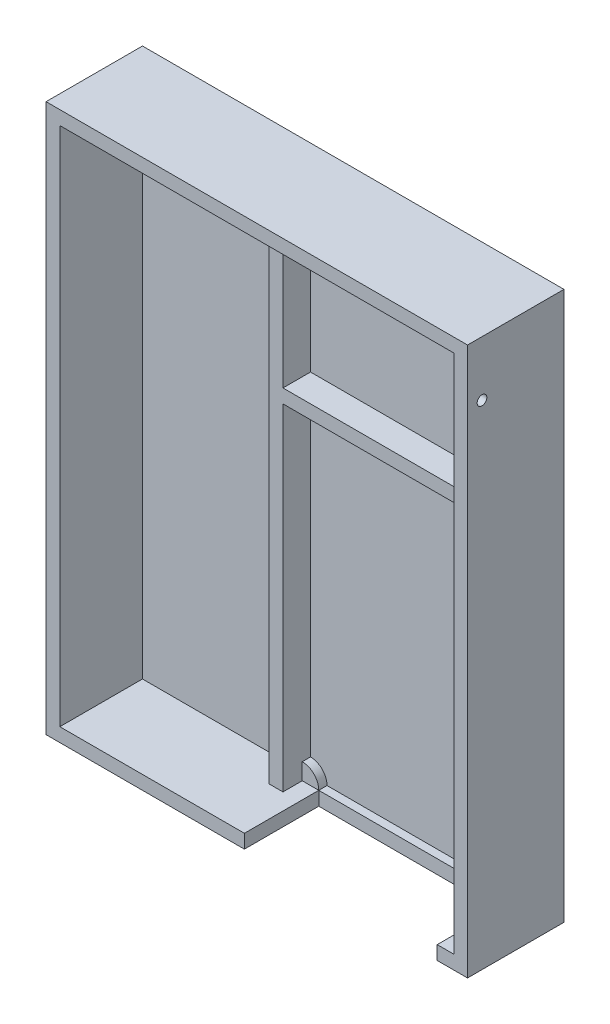
ISO-10303-21;
HEADER;
FILE_DESCRIPTION(('STEP AP214'),'2;1');
FILE_NAME('part.step','',(''),(''),'','','');
FILE_SCHEMA(('AUTOMOTIVE_DESIGN { 1 0 10303 214 1 1 1 1 }'));
ENDSEC;
DATA;
#1=APPLICATION_CONTEXT('core data for automotive mechanical design processes');
#2=APPLICATION_PROTOCOL_DEFINITION('international standard','automotive_design',2000,#1);
#3=PRODUCT_CONTEXT('',#1,'mechanical');
#4=PRODUCT('Part','Part','',(#3));
#5=PRODUCT_RELATED_PRODUCT_CATEGORY('part','',(#4));
#6=PRODUCT_DEFINITION_FORMATION('','',#4);
#7=PRODUCT_DEFINITION_CONTEXT('part definition',#1,'design');
#8=PRODUCT_DEFINITION('design','',#6,#7);
#9=PRODUCT_DEFINITION_SHAPE('','',#8);
#10=(LENGTH_UNIT() NAMED_UNIT(*) SI_UNIT(.MILLI.,.METRE.));
#11=(NAMED_UNIT(*) PLANE_ANGLE_UNIT() SI_UNIT($,.RADIAN.));
#12=(NAMED_UNIT(*) SI_UNIT($,.STERADIAN.) SOLID_ANGLE_UNIT());
#13=UNCERTAINTY_MEASURE_WITH_UNIT(LENGTH_MEASURE(1.E-05),#10,'distance_accuracy_value','');
#14=(GEOMETRIC_REPRESENTATION_CONTEXT(3) GLOBAL_UNCERTAINTY_ASSIGNED_CONTEXT((#13)) GLOBAL_UNIT_ASSIGNED_CONTEXT((#10,
#11,#12)) REPRESENTATION_CONTEXT('',''));
#15=CARTESIAN_POINT('',(0.,0.,0.));
#16=DIRECTION('',(0.,0.,1.));
#17=DIRECTION('',(1.,0.,0.));
#18=AXIS2_PLACEMENT_3D('',#15,#16,#17);
#19=CARTESIAN_POINT('',(-5.,4.99999999999998,10.));
#20=DIRECTION('',(0.,1.,0.));
#21=DIRECTION('',(-1.,0.,0.));
#22=AXIS2_PLACEMENT_3D('',#19,#20,#21);
#23=PLANE('',#22);
#24=DIRECTION('',(1.,0.,0.));
#25=VECTOR('',#24,1.);
#26=CARTESIAN_POINT('',(-5.00000000000005,4.99999999999998,3.));
#27=LINE('',#26,#25);
#28=CARTESIAN_POINT('',(-11.,5.,3.));
#29=VERTEX_POINT('',#28);
#30=CARTESIAN_POINT('',(-5.00000000000005,4.99999999999998,3.));
#31=VERTEX_POINT('',#30);
#32=EDGE_CURVE('E455',#29,#31,#27,.T.);
#33=ORIENTED_EDGE('',*,*,#32,.F.);
#34=DIRECTION('',(0.,0.,1.));
#35=VECTOR('',#34,1.);
#36=CARTESIAN_POINT('',(-11.,5.,-67.178344238091));
#37=LINE('',#36,#35);
#38=CARTESIAN_POINT('',(-11.,5.,30.));
#39=VERTEX_POINT('',#38);
#40=EDGE_CURVE('E430',#29,#39,#37,.T.);
#41=ORIENTED_EDGE('',*,*,#40,.T.);
#42=DIRECTION('',(1.,0.,0.));
#43=VECTOR('',#42,1.);
#44=CARTESIAN_POINT('',(-148.,4.99999999999998,30.));
#45=LINE('',#44,#43);
#46=CARTESIAN_POINT('',(-5.,4.99999999999998,30.));
#47=VERTEX_POINT('',#46);
#48=EDGE_CURVE('E381',#39,#47,#45,.T.);
#49=ORIENTED_EDGE('',*,*,#48,.T.);
#50=DIRECTION('',(0.,0.,-1.));
#51=VECTOR('',#50,1.);
#52=CARTESIAN_POINT('',(-5.,4.99999999999998,10.));
#53=LINE('',#52,#51);
#54=EDGE_CURVE('E304',#47,#31,#53,.T.);
#55=ORIENTED_EDGE('',*,*,#54,.T.);
#56=EDGE_LOOP('',(#33,#41,#49,#55));
#57=FACE_BOUND('',#56,.T.);
#58=ADVANCED_FACE('F39',(#57),#23,.T.);
#59=DIRECTION('',(-1.,0.,0.));
#60=VECTOR('',#59,1.);
#61=CARTESIAN_POINT('',(-81.,5.,3.));
#62=LINE('',#61,#60);
#63=CARTESIAN_POINT('',(-81.,5.,3.));
#64=VERTEX_POINT('',#63);
#65=EDGE_CURVE('E487',#29,#64,#62,.T.);
#66=ORIENTED_EDGE('',*,*,#65,.F.);
#67=DIRECTION('',(0.,0.,-1.));
#68=VECTOR('',#67,1.);
#69=CARTESIAN_POINT('',(-11.0000000000001,4.99999999999998,3.));
#70=LINE('',#69,#68);
#71=CARTESIAN_POINT('',(-11.0000000000001,4.99999999999998,0.));
#72=VERTEX_POINT('',#71);
#73=EDGE_CURVE('E449',#29,#72,#70,.T.);
#74=ORIENTED_EDGE('',*,*,#73,.T.);
#75=DIRECTION('',(1.,0.,0.));
#76=VECTOR('',#75,1.);
#77=CARTESIAN_POINT('',(-5.,4.99999999999998,0.));
#78=LINE('',#77,#76);
#79=CARTESIAN_POINT('',(-81.,5.,0.));
#80=VERTEX_POINT('',#79);
#81=EDGE_CURVE('E305',#80,#72,#78,.T.);
#82=ORIENTED_EDGE('',*,*,#81,.F.);
#83=DIRECTION('',(0.,0.,-1.));
#84=VECTOR('',#83,1.);
#85=CARTESIAN_POINT('',(-81.,5.,3.));
#86=LINE('',#85,#84);
#87=EDGE_CURVE('E431',#64,#80,#86,.T.);
#88=ORIENTED_EDGE('',*,*,#87,.F.);
#89=EDGE_LOOP('',(#66,#74,#82,#88));
#90=FACE_BOUND('',#89,.T.);
#91=ADVANCED_FACE('F486',(#90),#23,.T.);
#92=CARTESIAN_POINT('',(-153.,199.,-5.));
#93=DIRECTION('',(0.,1.,0.));
#94=DIRECTION('',(-1.,0.,0.));
#95=AXIS2_PLACEMENT_3D('',#92,#93,#94);
#96=PLANE('',#95);
#97=DIRECTION('',(0.,0.,1.));
#98=VECTOR('',#97,1.);
#99=CARTESIAN_POINT('',(-153.,199.,-5.));
#100=LINE('',#99,#98);
#101=CARTESIAN_POINT('',(-153.,199.,-5.));
#102=VERTEX_POINT('',#101);
#103=CARTESIAN_POINT('',(-153.,199.,30.));
#104=VERTEX_POINT('',#103);
#105=EDGE_CURVE('E338',#102,#104,#100,.T.);
#106=ORIENTED_EDGE('',*,*,#105,.T.);
#107=DIRECTION('',(-1.,0.,0.));
#108=VECTOR('',#107,1.);
#109=CARTESIAN_POINT('',(0.,199.,30.));
#110=LINE('',#109,#108);
#111=CARTESIAN_POINT('',(0.,199.,30.));
#112=VERTEX_POINT('',#111);
#113=EDGE_CURVE('E402',#112,#104,#110,.T.);
#114=ORIENTED_EDGE('',*,*,#113,.F.);
#115=DIRECTION('',(0.,0.,1.));
#116=VECTOR('',#115,1.);
#117=CARTESIAN_POINT('',(0.,199.,-5.));
#118=LINE('',#117,#116);
#119=CARTESIAN_POINT('',(0.,199.,-5.));
#120=VERTEX_POINT('',#119);
#121=EDGE_CURVE('E340',#120,#112,#118,.T.);
#122=ORIENTED_EDGE('',*,*,#121,.F.);
#123=DIRECTION('',(-1.,0.,0.));
#124=VECTOR('',#123,1.);
#125=CARTESIAN_POINT('',(-153.,199.,-5.));
#126=LINE('',#125,#124);
#127=EDGE_CURVE('E330',#120,#102,#126,.T.);
#128=ORIENTED_EDGE('',*,*,#127,.T.);
#129=EDGE_LOOP('',(#106,#114,#122,#128));
#130=FACE_BOUND('',#129,.T.);
#131=ADVANCED_FACE('F552',(#130),#96,.T.);
#132=CARTESIAN_POINT('',(0.,0.,-5.));
#133=DIRECTION('',(1.,0.,0.));
#134=DIRECTION('',(0.,0.,-1.));
#135=AXIS2_PLACEMENT_3D('',#132,#133,#134);
#136=PLANE('',#135);
#137=CARTESIAN_POINT('',(0.,179.,24.75));
#138=DIRECTION('',(1.,0.,0.));
#139=DIRECTION('',(0.,0.,-1.));
#140=AXIS2_PLACEMENT_3D('',#137,#138,#139);
#141=CIRCLE('',#140,1.75000000000001);
#142=CARTESIAN_POINT('',(0.,179.,23.));
#143=VERTEX_POINT('',#142);
#144=EDGE_CURVE('E226',#143,#143,#141,.F.);
#145=ORIENTED_EDGE('',*,*,#144,.T.);
#146=EDGE_LOOP('',(#145));
#147=FACE_BOUND('',#146,.T.);
#148=ORIENTED_EDGE('',*,*,#121,.T.);
#149=DIRECTION('',(0.,1.,0.));
#150=VECTOR('',#149,1.);
#151=CARTESIAN_POINT('',(0.,0.,30.));
#152=LINE('',#151,#150);
#153=CARTESIAN_POINT('',(0.,0.,30.));
#154=VERTEX_POINT('',#153);
#155=EDGE_CURVE('E395',#154,#112,#152,.T.);
#156=ORIENTED_EDGE('',*,*,#155,.F.);
#157=DIRECTION('',(0.,0.,1.));
#158=VECTOR('',#157,1.);
#159=CARTESIAN_POINT('',(0.,0.,-5.));
#160=LINE('',#159,#158);
#161=CARTESIAN_POINT('',(0.,0.,-5.));
#162=VERTEX_POINT('',#161);
#163=EDGE_CURVE('E341',#162,#154,#160,.T.);
#164=ORIENTED_EDGE('',*,*,#163,.F.);
#165=DIRECTION('',(0.,1.,0.));
#166=VECTOR('',#165,1.);
#167=CARTESIAN_POINT('',(0.,0.,-5.));
#168=LINE('',#167,#166);
#169=EDGE_CURVE('E336',#162,#120,#168,.T.);
#170=ORIENTED_EDGE('',*,*,#169,.T.);
#171=EDGE_LOOP('',(#148,#156,#164,#170));
#172=FACE_BOUND('',#171,.T.);
#173=ADVANCED_FACE('F412',(#147,#172),#136,.T.);
#174=CARTESIAN_POINT('',(-153.,0.,-5.));
#175=DIRECTION('',(0.,-1.,0.));
#176=DIRECTION('',(1.,0.,0.));
#177=AXIS2_PLACEMENT_3D('',#174,#175,#176);
#178=PLANE('',#177);
#179=DIRECTION('',(0.,0.,1.));
#180=VECTOR('',#179,1.);
#181=CARTESIAN_POINT('',(-11.,0.,-67.178344238091));
#182=LINE('',#181,#180);
#183=CARTESIAN_POINT('',(-11.,0.,3.));
#184=VERTEX_POINT('',#183);
#185=CARTESIAN_POINT('',(-11.,0.,30.));
#186=VERTEX_POINT('',#185);
#187=EDGE_CURVE('E237',#184,#186,#182,.T.);
#188=ORIENTED_EDGE('',*,*,#187,.F.);
#189=DIRECTION('',(-1.,0.,0.));
#190=VECTOR('',#189,1.);
#191=CARTESIAN_POINT('',(-81.,0.,3.));
#192=LINE('',#191,#190);
#193=CARTESIAN_POINT('',(-81.,0.,3.));
#194=VERTEX_POINT('',#193);
#195=EDGE_CURVE('E234',#184,#194,#192,.T.);
#196=ORIENTED_EDGE('',*,*,#195,.T.);
#197=DIRECTION('',(0.,0.,1.));
#198=VECTOR('',#197,1.);
#199=CARTESIAN_POINT('',(-81.,0.,-67.178344238091));
#200=LINE('',#199,#198);
#201=CARTESIAN_POINT('',(-81.,0.,30.));
#202=VERTEX_POINT('',#201);
#203=EDGE_CURVE('E53',#194,#202,#200,.T.);
#204=ORIENTED_EDGE('',*,*,#203,.T.);
#205=DIRECTION('',(1.,0.,0.));
#206=VECTOR('',#205,1.);
#207=CARTESIAN_POINT('',(0.,0.,30.));
#208=LINE('',#207,#206);
#209=CARTESIAN_POINT('',(-153.,0.,30.));
#210=VERTEX_POINT('',#209);
#211=EDGE_CURVE('E231',#210,#202,#208,.T.);
#212=ORIENTED_EDGE('',*,*,#211,.F.);
#213=DIRECTION('',(0.,0.,1.));
#214=VECTOR('',#213,1.);
#215=CARTESIAN_POINT('',(-153.,0.,-5.));
#216=LINE('',#215,#214);
#217=CARTESIAN_POINT('',(-153.,0.,-5.));
#218=VERTEX_POINT('',#217);
#219=EDGE_CURVE('E347',#218,#210,#216,.T.);
#220=ORIENTED_EDGE('',*,*,#219,.F.);
#221=DIRECTION('',(1.,0.,0.));
#222=VECTOR('',#221,1.);
#223=CARTESIAN_POINT('',(-153.,0.,-5.));
#224=LINE('',#223,#222);
#225=EDGE_CURVE('E334',#218,#162,#224,.T.);
#226=ORIENTED_EDGE('',*,*,#225,.T.);
#227=ORIENTED_EDGE('',*,*,#163,.T.);
#228=EDGE_CURVE('E243',#186,#154,#208,.T.);
#229=ORIENTED_EDGE('',*,*,#228,.F.);
#230=EDGE_LOOP('',(#188,#196,#204,#212,#220,#226,#227,#229));
#231=FACE_BOUND('',#230,.T.);
#232=ADVANCED_FACE('F235',(#231),#178,.T.);
#233=CARTESIAN_POINT('',(-153.,0.,-5.));
#234=DIRECTION('',(-1.,0.,0.));
#235=DIRECTION('',(0.,0.,1.));
#236=AXIS2_PLACEMENT_3D('',#233,#234,#235);
#237=PLANE('',#236);
#238=ORIENTED_EDGE('',*,*,#219,.T.);
#239=DIRECTION('',(0.,-1.,0.));
#240=VECTOR('',#239,1.);
#241=CARTESIAN_POINT('',(-153.,0.,30.));
#242=LINE('',#241,#240);
#243=EDGE_CURVE('E242',#104,#210,#242,.T.);
#244=ORIENTED_EDGE('',*,*,#243,.F.);
#245=ORIENTED_EDGE('',*,*,#105,.F.);
#246=DIRECTION('',(0.,-1.,0.));
#247=VECTOR('',#246,1.);
#248=CARTESIAN_POINT('',(-153.,0.,-5.));
#249=LINE('',#248,#247);
#250=EDGE_CURVE('E329',#102,#218,#249,.T.);
#251=ORIENTED_EDGE('',*,*,#250,.T.);
#252=EDGE_LOOP('',(#238,#244,#245,#251));
#253=FACE_BOUND('',#252,.T.);
#254=ADVANCED_FACE('F406',(#253),#237,.T.);
#255=CARTESIAN_POINT('',(0.,0.,-5.));
#256=DIRECTION('',(0.,0.,1.));
#257=DIRECTION('',(1.,0.,0.));
#258=AXIS2_PLACEMENT_3D('',#255,#256,#257);
#259=PLANE('',#258);
#260=ORIENTED_EDGE('',*,*,#127,.F.);
#261=ORIENTED_EDGE('',*,*,#169,.F.);
#262=ORIENTED_EDGE('',*,*,#225,.F.);
#263=ORIENTED_EDGE('',*,*,#250,.F.);
#264=EDGE_LOOP('',(#260,#261,#262,#263));
#265=FACE_BOUND('',#264,.T.);
#266=ADVANCED_FACE('F415',(#265),#259,.F.);
#267=CARTESIAN_POINT('',(0.,0.,30.));
#268=DIRECTION('',(0.,0.,1.));
#269=DIRECTION('',(1.,0.,0.));
#270=AXIS2_PLACEMENT_3D('',#267,#268,#269);
#271=PLANE('',#270);
#272=DIRECTION('',(0.,-1.,0.));
#273=VECTOR('',#272,1.);
#274=CARTESIAN_POINT('',(-81.,5.,30.));
#275=LINE('',#274,#273);
#276=CARTESIAN_POINT('',(-81.,5.,30.));
#277=VERTEX_POINT('',#276);
#278=EDGE_CURVE('E220',#277,#202,#275,.T.);
#279=ORIENTED_EDGE('',*,*,#278,.F.);
#280=CARTESIAN_POINT('',(-148.,4.99999999999998,30.));
#281=VERTEX_POINT('',#280);
#282=EDGE_CURVE('E390',#281,#277,#45,.T.);
#283=ORIENTED_EDGE('',*,*,#282,.F.);
#284=DIRECTION('',(0.,-1.,0.));
#285=VECTOR('',#284,1.);
#286=CARTESIAN_POINT('',(-148.,194.,30.));
#287=LINE('',#286,#285);
#288=CARTESIAN_POINT('',(-148.,194.,30.));
#289=VERTEX_POINT('',#288);
#290=EDGE_CURVE('E380',#289,#281,#287,.T.);
#291=ORIENTED_EDGE('',*,*,#290,.F.);
#292=DIRECTION('',(-1.,0.,0.));
#293=VECTOR('',#292,1.);
#294=CARTESIAN_POINT('',(-148.,194.,30.));
#295=LINE('',#294,#293);
#296=CARTESIAN_POINT('',(-5.00000000000003,194.,30.));
#297=VERTEX_POINT('',#296);
#298=EDGE_CURVE('E392',#297,#289,#295,.T.);
#299=ORIENTED_EDGE('',*,*,#298,.F.);
#300=DIRECTION('',(0.,1.,0.));
#301=VECTOR('',#300,1.);
#302=CARTESIAN_POINT('',(-5.00000000000003,194.,30.));
#303=LINE('',#302,#301);
#304=EDGE_CURVE('E386',#47,#297,#303,.T.);
#305=ORIENTED_EDGE('',*,*,#304,.F.);
#306=ORIENTED_EDGE('',*,*,#48,.F.);
#307=DIRECTION('',(0.,1.,0.));
#308=VECTOR('',#307,1.);
#309=CARTESIAN_POINT('',(-11.,0.,30.));
#310=LINE('',#309,#308);
#311=EDGE_CURVE('E223',#186,#39,#310,.T.);
#312=ORIENTED_EDGE('',*,*,#311,.F.);
#313=ORIENTED_EDGE('',*,*,#228,.T.);
#314=ORIENTED_EDGE('',*,*,#155,.T.);
#315=ORIENTED_EDGE('',*,*,#113,.T.);
#316=ORIENTED_EDGE('',*,*,#243,.T.);
#317=ORIENTED_EDGE('',*,*,#211,.T.);
#318=EDGE_LOOP('',(#279,#283,#291,#299,#305,#306,#312,#313,#314,#315,#316,#317));
#319=FACE_BOUND('',#318,.T.);
#320=ADVANCED_FACE('F239',(#319),#271,.T.);
#321=CARTESIAN_POINT('',(0.,0.,0.));
#322=DIRECTION('',(0.,0.,1.));
#323=DIRECTION('',(1.,0.,0.));
#324=AXIS2_PLACEMENT_3D('',#321,#322,#323);
#325=PLANE('',#324);
#326=DIRECTION('',(0.,-1.,0.));
#327=VECTOR('',#326,1.);
#328=CARTESIAN_POINT('',(-87.,4.99999999999997,0.));
#329=LINE('',#328,#327);
#330=CARTESIAN_POINT('',(-87.,121.,0.));
#331=VERTEX_POINT('',#330);
#332=CARTESIAN_POINT('',(-87.,11.,0.));
#333=VERTEX_POINT('',#332);
#334=EDGE_CURVE('E313',#331,#333,#329,.T.);
#335=ORIENTED_EDGE('',*,*,#334,.T.);
#336=CARTESIAN_POINT('',(-87.,5.00000000000001,0.));
#337=DIRECTION('',(0.,0.,1.));
#338=DIRECTION('',(1.,0.,0.));
#339=AXIS2_PLACEMENT_3D('',#336,#337,#338);
#340=CIRCLE('',#339,6.);
#341=EDGE_CURVE('E356',#333,#80,#340,.F.);
#342=ORIENTED_EDGE('',*,*,#341,.T.);
#343=ORIENTED_EDGE('',*,*,#81,.T.);
#344=CARTESIAN_POINT('',(-5.00000000000005,4.99999999999997,0.));
#345=DIRECTION('',(0.,0.,1.));
#346=DIRECTION('',(1.,0.,0.));
#347=AXIS2_PLACEMENT_3D('',#344,#345,#346);
#348=CIRCLE('',#347,6.);
#349=CARTESIAN_POINT('',(-5.00000000000005,11.,0.));
#350=VERTEX_POINT('',#349);
#351=EDGE_CURVE('E359',#72,#350,#348,.F.);
#352=ORIENTED_EDGE('',*,*,#351,.T.);
#353=DIRECTION('',(0.,1.,0.));
#354=VECTOR('',#353,1.);
#355=CARTESIAN_POINT('',(-5.,4.99999999999998,0.));
#356=LINE('',#355,#354);
#357=CARTESIAN_POINT('',(-5.,121.,0.));
#358=VERTEX_POINT('',#357);
#359=EDGE_CURVE('E299',#350,#358,#356,.T.);
#360=ORIENTED_EDGE('',*,*,#359,.T.);
#361=CARTESIAN_POINT('',(-5.00000000000002,127.,0.));
#362=DIRECTION('',(0.,0.,1.));
#363=DIRECTION('',(1.,0.,0.));
#364=AXIS2_PLACEMENT_3D('',#361,#362,#363);
#365=CIRCLE('',#364,6.);
#366=CARTESIAN_POINT('',(-11.,127.,0.));
#367=VERTEX_POINT('',#366);
#368=EDGE_CURVE('E11',#358,#367,#365,.F.);
#369=ORIENTED_EDGE('',*,*,#368,.T.);
#370=DIRECTION('',(-1.,0.,0.));
#371=VECTOR('',#370,1.);
#372=CARTESIAN_POINT('',(-5.,127.,0.));
#373=LINE('',#372,#371);
#374=CARTESIAN_POINT('',(-81.,127.,0.));
#375=VERTEX_POINT('',#374);
#376=EDGE_CURVE('E306',#367,#375,#373,.T.);
#377=ORIENTED_EDGE('',*,*,#376,.T.);
#378=CARTESIAN_POINT('',(-87.,127.,0.));
#379=DIRECTION('',(0.,0.,1.));
#380=DIRECTION('',(1.,0.,0.));
#381=AXIS2_PLACEMENT_3D('',#378,#379,#380);
#382=CIRCLE('',#381,6.);
#383=EDGE_CURVE('E50',#375,#331,#382,.F.);
#384=ORIENTED_EDGE('',*,*,#383,.T.);
#385=EDGE_LOOP('',(#335,#342,#343,#352,#360,#369,#377,#384));
#386=FACE_BOUND('',#385,.T.);
#387=ADVANCED_FACE('F361',(#386),#325,.T.);
#388=DIRECTION('',(-1.,0.,0.));
#389=VECTOR('',#388,1.);
#390=CARTESIAN_POINT('',(-87.,194.,0.));
#391=LINE('',#390,#389);
#392=CARTESIAN_POINT('',(-5.,194.,0.));
#393=VERTEX_POINT('',#392);
#394=CARTESIAN_POINT('',(-87.,194.,0.));
#395=VERTEX_POINT('',#394);
#396=EDGE_CURVE('E277',#393,#395,#391,.T.);
#397=ORIENTED_EDGE('',*,*,#396,.T.);
#398=DIRECTION('',(0.,-1.,0.));
#399=VECTOR('',#398,1.);
#400=CARTESIAN_POINT('',(-87.,132.,0.));
#401=LINE('',#400,#399);
#402=CARTESIAN_POINT('',(-87.,132.,0.));
#403=VERTEX_POINT('',#402);
#404=EDGE_CURVE('E275',#395,#403,#401,.T.);
#405=ORIENTED_EDGE('',*,*,#404,.T.);
#406=DIRECTION('',(1.,0.,0.));
#407=VECTOR('',#406,1.);
#408=CARTESIAN_POINT('',(-87.,132.,0.));
#409=LINE('',#408,#407);
#410=CARTESIAN_POINT('',(-5.,132.,0.));
#411=VERTEX_POINT('',#410);
#412=EDGE_CURVE('E282',#403,#411,#409,.T.);
#413=ORIENTED_EDGE('',*,*,#412,.T.);
#414=DIRECTION('',(0.,1.,0.));
#415=VECTOR('',#414,1.);
#416=CARTESIAN_POINT('',(-5.,132.,0.));
#417=LINE('',#416,#415);
#418=EDGE_CURVE('E285',#411,#393,#417,.T.);
#419=ORIENTED_EDGE('',*,*,#418,.T.);
#420=EDGE_LOOP('',(#397,#405,#413,#419));
#421=FACE_BOUND('',#420,.T.);
#422=ADVANCED_FACE('F516',(#421),#325,.T.);
#423=CARTESIAN_POINT('',(-87.,132.,10.));
#424=DIRECTION('',(1.,0.,0.));
#425=DIRECTION('',(0.,0.,-1.));
#426=AXIS2_PLACEMENT_3D('',#423,#424,#425);
#427=PLANE('',#426);
#428=ORIENTED_EDGE('',*,*,#404,.F.);
#429=DIRECTION('',(0.,0.,-1.));
#430=VECTOR('',#429,1.);
#431=CARTESIAN_POINT('',(-87.,194.,10.));
#432=LINE('',#431,#430);
#433=CARTESIAN_POINT('',(-87.,194.,10.));
#434=VERTEX_POINT('',#433);
#435=EDGE_CURVE('E276',#434,#395,#432,.T.);
#436=ORIENTED_EDGE('',*,*,#435,.F.);
#437=DIRECTION('',(0.,-1.,0.));
#438=VECTOR('',#437,1.);
#439=CARTESIAN_POINT('',(-87.,132.,10.));
#440=LINE('',#439,#438);
#441=CARTESIAN_POINT('',(-87.,132.,10.));
#442=VERTEX_POINT('',#441);
#443=EDGE_CURVE('E272',#434,#442,#440,.T.);
#444=ORIENTED_EDGE('',*,*,#443,.T.);
#445=DIRECTION('',(0.,0.,-1.));
#446=VECTOR('',#445,1.);
#447=CARTESIAN_POINT('',(-87.,132.,10.));
#448=LINE('',#447,#446);
#449=EDGE_CURVE('E293',#442,#403,#448,.T.);
#450=ORIENTED_EDGE('',*,*,#449,.T.);
#451=EDGE_LOOP('',(#428,#436,#444,#450));
#452=FACE_BOUND('',#451,.T.);
#453=ADVANCED_FACE('F511',(#452),#427,.T.);
#454=CARTESIAN_POINT('',(-87.,194.,10.));
#455=DIRECTION('',(0.,-1.,0.));
#456=DIRECTION('',(0.,0.,-1.));
#457=AXIS2_PLACEMENT_3D('',#454,#455,#456);
#458=PLANE('',#457);
#459=ORIENTED_EDGE('',*,*,#396,.F.);
#460=DIRECTION('',(0.,0.,-1.));
#461=VECTOR('',#460,1.);
#462=CARTESIAN_POINT('',(-5.,194.,10.));
#463=LINE('',#462,#461);
#464=EDGE_CURVE('E292',#297,#393,#463,.T.);
#465=ORIENTED_EDGE('',*,*,#464,.F.);
#466=ORIENTED_EDGE('',*,*,#298,.T.);
#467=DIRECTION('',(0.,0.,-1.));
#468=VECTOR('',#467,1.);
#469=CARTESIAN_POINT('',(-148.,194.,10.));
#470=LINE('',#469,#468);
#471=CARTESIAN_POINT('',(-148.,194.,0.));
#472=VERTEX_POINT('',#471);
#473=EDGE_CURVE('E255',#289,#472,#470,.T.);
#474=ORIENTED_EDGE('',*,*,#473,.T.);
#475=DIRECTION('',(-1.,0.,0.));
#476=VECTOR('',#475,1.);
#477=CARTESIAN_POINT('',(-148.,194.,0.));
#478=LINE('',#477,#476);
#479=CARTESIAN_POINT('',(-92.,194.,0.));
#480=VERTEX_POINT('',#479);
#481=EDGE_CURVE('E254',#480,#472,#478,.T.);
#482=ORIENTED_EDGE('',*,*,#481,.F.);
#483=DIRECTION('',(0.,0.,-1.));
#484=VECTOR('',#483,1.);
#485=CARTESIAN_POINT('',(-92.,194.,10.));
#486=LINE('',#485,#484);
#487=CARTESIAN_POINT('',(-92.,194.,10.));
#488=VERTEX_POINT('',#487);
#489=EDGE_CURVE('E264',#488,#480,#486,.T.);
#490=ORIENTED_EDGE('',*,*,#489,.F.);
#491=DIRECTION('',(-1.,0.,0.));
#492=VECTOR('',#491,1.);
#493=CARTESIAN_POINT('',(-148.,194.,10.));
#494=LINE('',#493,#492);
#495=EDGE_CURVE('E345',#434,#488,#494,.T.);
#496=ORIENTED_EDGE('',*,*,#495,.F.);
#497=ORIENTED_EDGE('',*,*,#435,.T.);
#498=EDGE_LOOP('',(#459,#465,#466,#474,#482,#490,#496,#497));
#499=FACE_BOUND('',#498,.T.);
#500=ADVANCED_FACE('F518',(#499),#458,.T.);
#501=CARTESIAN_POINT('',(-87.,132.,10.));
#502=DIRECTION('',(0.,1.,0.));
#503=DIRECTION('',(0.,0.,1.));
#504=AXIS2_PLACEMENT_3D('',#501,#502,#503);
#505=PLANE('',#504);
#506=ORIENTED_EDGE('',*,*,#412,.F.);
#507=ORIENTED_EDGE('',*,*,#449,.F.);
#508=DIRECTION('',(1.,0.,0.));
#509=VECTOR('',#508,1.);
#510=CARTESIAN_POINT('',(-87.,132.,10.));
#511=LINE('',#510,#509);
#512=CARTESIAN_POINT('',(-5.00000000000002,132.,10.));
#513=VERTEX_POINT('',#512);
#514=EDGE_CURVE('E274',#442,#513,#511,.T.);
#515=ORIENTED_EDGE('',*,*,#514,.T.);
#516=DIRECTION('',(0.,0.,-1.));
#517=VECTOR('',#516,1.);
#518=CARTESIAN_POINT('',(-5.,132.,10.));
#519=LINE('',#518,#517);
#520=EDGE_CURVE('E291',#513,#411,#519,.T.);
#521=ORIENTED_EDGE('',*,*,#520,.T.);
#522=EDGE_LOOP('',(#506,#507,#515,#521));
#523=FACE_BOUND('',#522,.T.);
#524=ADVANCED_FACE('F509',(#523),#505,.T.);
#525=CARTESIAN_POINT('',(-5.,127.,10.));
#526=DIRECTION('',(0.,-1.,0.));
#527=DIRECTION('',(0.,0.,-1.));
#528=AXIS2_PLACEMENT_3D('',#525,#526,#527);
#529=PLANE('',#528);
#530=DIRECTION('',(0.,0.,-1.));
#531=VECTOR('',#530,1.);
#532=CARTESIAN_POINT('',(-11.,127.,3.));
#533=LINE('',#532,#531);
#534=CARTESIAN_POINT('',(-11.,127.,3.));
#535=VERTEX_POINT('',#534);
#536=EDGE_CURVE('E433',#535,#367,#533,.T.);
#537=ORIENTED_EDGE('',*,*,#536,.F.);
#538=DIRECTION('',(-1.,0.,0.));
#539=VECTOR('',#538,1.);
#540=CARTESIAN_POINT('',(-5.00000000000002,127.,3.));
#541=LINE('',#540,#539);
#542=CARTESIAN_POINT('',(-5.00000000000002,127.,3.));
#543=VERTEX_POINT('',#542);
#544=EDGE_CURVE('E445',#543,#535,#541,.T.);
#545=ORIENTED_EDGE('',*,*,#544,.F.);
#546=DIRECTION('',(0.,0.,-1.));
#547=VECTOR('',#546,1.);
#548=CARTESIAN_POINT('',(-5.,127.,10.));
#549=LINE('',#548,#547);
#550=CARTESIAN_POINT('',(-5.00000000000002,127.,10.));
#551=VERTEX_POINT('',#550);
#552=EDGE_CURVE('E322',#551,#543,#549,.T.);
#553=ORIENTED_EDGE('',*,*,#552,.F.);
#554=DIRECTION('',(-1.,0.,0.));
#555=VECTOR('',#554,1.);
#556=CARTESIAN_POINT('',(-5.,127.,10.));
#557=LINE('',#556,#555);
#558=CARTESIAN_POINT('',(-87.,127.,10.));
#559=VERTEX_POINT('',#558);
#560=EDGE_CURVE('E298',#551,#559,#557,.T.);
#561=ORIENTED_EDGE('',*,*,#560,.T.);
#562=DIRECTION('',(0.,0.,-1.));
#563=VECTOR('',#562,1.);
#564=CARTESIAN_POINT('',(-87.,127.,10.));
#565=LINE('',#564,#563);
#566=CARTESIAN_POINT('',(-87.,127.,3.));
#567=VERTEX_POINT('',#566);
#568=EDGE_CURVE('E321',#559,#567,#565,.T.);
#569=ORIENTED_EDGE('',*,*,#568,.T.);
#570=DIRECTION('',(-1.,0.,0.));
#571=VECTOR('',#570,1.);
#572=CARTESIAN_POINT('',(-87.,127.,3.));
#573=LINE('',#572,#571);
#574=CARTESIAN_POINT('',(-81.,127.,3.));
#575=VERTEX_POINT('',#574);
#576=EDGE_CURVE('E382',#575,#567,#573,.T.);
#577=ORIENTED_EDGE('',*,*,#576,.F.);
#578=DIRECTION('',(0.,0.,-1.));
#579=VECTOR('',#578,1.);
#580=CARTESIAN_POINT('',(-81.,127.,3.));
#581=LINE('',#580,#579);
#582=EDGE_CURVE('E378',#575,#375,#581,.T.);
#583=ORIENTED_EDGE('',*,*,#582,.T.);
#584=ORIENTED_EDGE('',*,*,#376,.F.);
#585=EDGE_LOOP('',(#537,#545,#553,#561,#569,#577,#583,#584));
#586=FACE_BOUND('',#585,.T.);
#587=ADVANCED_FACE('F465',(#586),#529,.T.);
#588=CARTESIAN_POINT('',(-5.,4.99999999999998,10.));
#589=DIRECTION('',(-1.,0.,0.));
#590=DIRECTION('',(0.,-1.,0.));
#591=AXIS2_PLACEMENT_3D('',#588,#589,#590);
#592=PLANE('',#591);
#593=CARTESIAN_POINT('',(-5.,179.,24.75));
#594=DIRECTION('',(-1.,0.,0.));
#595=DIRECTION('',(0.,-1.,0.));
#596=AXIS2_PLACEMENT_3D('',#593,#594,#595);
#597=CIRCLE('',#596,1.75000000000001);
#598=CARTESIAN_POINT('',(-5.,177.25,24.75));
#599=VERTEX_POINT('',#598);
#600=EDGE_CURVE('E751',#599,#599,#597,.T.);
#601=ORIENTED_EDGE('',*,*,#600,.F.);
#602=EDGE_LOOP('',(#601));
#603=FACE_BOUND('',#602,.T.);
#604=DIRECTION('',(0.,0.,-1.));
#605=VECTOR('',#604,1.);
#606=CARTESIAN_POINT('',(-5.00000000000005,11.,3.));
#607=LINE('',#606,#605);
#608=CARTESIAN_POINT('',(-5.00000000000005,11.,3.));
#609=VERTEX_POINT('',#608);
#610=EDGE_CURVE('E443',#609,#350,#607,.T.);
#611=ORIENTED_EDGE('',*,*,#610,.F.);
#612=DIRECTION('',(0.,1.,0.));
#613=VECTOR('',#612,1.);
#614=CARTESIAN_POINT('',(-5.00000000000005,4.99999999999998,3.));
#615=LINE('',#614,#613);
#616=EDGE_CURVE('E440',#31,#609,#615,.T.);
#617=ORIENTED_EDGE('',*,*,#616,.F.);
#618=ORIENTED_EDGE('',*,*,#54,.F.);
#619=ORIENTED_EDGE('',*,*,#304,.T.);
#620=ORIENTED_EDGE('',*,*,#464,.T.);
#621=ORIENTED_EDGE('',*,*,#418,.F.);
#622=ORIENTED_EDGE('',*,*,#520,.F.);
#623=DIRECTION('',(0.,1.,0.));
#624=VECTOR('',#623,1.);
#625=CARTESIAN_POINT('',(-5.00000000000003,194.,10.));
#626=LINE('',#625,#624);
#627=EDGE_CURVE('E400',#551,#513,#626,.T.);
#628=ORIENTED_EDGE('',*,*,#627,.F.);
#629=ORIENTED_EDGE('',*,*,#552,.T.);
#630=DIRECTION('',(0.,1.,0.));
#631=VECTOR('',#630,1.);
#632=CARTESIAN_POINT('',(-5.00000000000002,127.,3.));
#633=LINE('',#632,#631);
#634=CARTESIAN_POINT('',(-5.00000000000002,121.,3.));
#635=VERTEX_POINT('',#634);
#636=EDGE_CURVE('E439',#635,#543,#633,.T.);
#637=ORIENTED_EDGE('',*,*,#636,.F.);
#638=DIRECTION('',(0.,0.,-1.));
#639=VECTOR('',#638,1.);
#640=CARTESIAN_POINT('',(-5.00000000000002,121.,3.));
#641=LINE('',#640,#639);
#642=EDGE_CURVE('E436',#635,#358,#641,.T.);
#643=ORIENTED_EDGE('',*,*,#642,.T.);
#644=ORIENTED_EDGE('',*,*,#359,.F.);
#645=EDGE_LOOP('',(#611,#617,#618,#619,#620,#621,#622,#628,#629,#637,#643,#644));
#646=FACE_BOUND('',#645,.T.);
#647=ADVANCED_FACE('F497',(#603,#646),#592,.T.);
#648=DIRECTION('',(0.,0.,1.));
#649=VECTOR('',#648,1.);
#650=CARTESIAN_POINT('',(-81.,5.,-67.178344238091));
#651=LINE('',#650,#649);
#652=EDGE_CURVE('E219',#64,#277,#651,.T.);
#653=ORIENTED_EDGE('',*,*,#652,.F.);
#654=DIRECTION('',(1.,0.,0.));
#655=VECTOR('',#654,1.);
#656=CARTESIAN_POINT('',(-87.,5.,3.));
#657=LINE('',#656,#655);
#658=CARTESIAN_POINT('',(-87.,5.,3.));
#659=VERTEX_POINT('',#658);
#660=EDGE_CURVE('E448',#659,#64,#657,.T.);
#661=ORIENTED_EDGE('',*,*,#660,.F.);
#662=DIRECTION('',(0.,0.,-1.));
#663=VECTOR('',#662,1.);
#664=CARTESIAN_POINT('',(-87.,4.99999999999997,10.));
#665=LINE('',#664,#663);
#666=CARTESIAN_POINT('',(-87.,4.99999999999998,10.));
#667=VERTEX_POINT('',#666);
#668=EDGE_CURVE('E318',#667,#659,#665,.T.);
#669=ORIENTED_EDGE('',*,*,#668,.F.);
#670=DIRECTION('',(1.,0.,0.));
#671=VECTOR('',#670,1.);
#672=CARTESIAN_POINT('',(-148.,4.99999999999998,10.));
#673=LINE('',#672,#671);
#674=CARTESIAN_POINT('',(-92.,4.99999999999998,10.));
#675=VERTEX_POINT('',#674);
#676=EDGE_CURVE('E352',#675,#667,#673,.T.);
#677=ORIENTED_EDGE('',*,*,#676,.F.);
#678=DIRECTION('',(0.,0.,-1.));
#679=VECTOR('',#678,1.);
#680=CARTESIAN_POINT('',(-92.,4.99999999999997,10.));
#681=LINE('',#680,#679);
#682=CARTESIAN_POINT('',(-92.,4.99999999999997,0.));
#683=VERTEX_POINT('',#682);
#684=EDGE_CURVE('E270',#675,#683,#681,.T.);
#685=ORIENTED_EDGE('',*,*,#684,.T.);
#686=DIRECTION('',(1.,0.,0.));
#687=VECTOR('',#686,1.);
#688=CARTESIAN_POINT('',(-148.,4.99999999999997,0.));
#689=LINE('',#688,#687);
#690=CARTESIAN_POINT('',(-148.,4.99999999999997,0.));
#691=VERTEX_POINT('',#690);
#692=EDGE_CURVE('E250',#691,#683,#689,.T.);
#693=ORIENTED_EDGE('',*,*,#692,.F.);
#694=DIRECTION('',(0.,0.,-1.));
#695=VECTOR('',#694,1.);
#696=CARTESIAN_POINT('',(-148.,4.99999999999997,10.));
#697=LINE('',#696,#695);
#698=EDGE_CURVE('E267',#281,#691,#697,.T.);
#699=ORIENTED_EDGE('',*,*,#698,.F.);
#700=ORIENTED_EDGE('',*,*,#282,.T.);
#701=EDGE_LOOP('',(#653,#661,#669,#677,#685,#693,#699,#700));
#702=FACE_BOUND('',#701,.T.);
#703=ADVANCED_FACE('F480',(#702),#23,.T.);
#704=CARTESIAN_POINT('',(-87.,4.99999999999997,10.));
#705=DIRECTION('',(1.,0.,0.));
#706=DIRECTION('',(0.,0.,-1.));
#707=AXIS2_PLACEMENT_3D('',#704,#705,#706);
#708=PLANE('',#707);
#709=DIRECTION('',(0.,-1.,0.));
#710=VECTOR('',#709,1.);
#711=CARTESIAN_POINT('',(-87.,5.,3.));
#712=LINE('',#711,#710);
#713=CARTESIAN_POINT('',(-87.,11.,3.));
#714=VERTEX_POINT('',#713);
#715=EDGE_CURVE('E456',#714,#659,#712,.T.);
#716=ORIENTED_EDGE('',*,*,#715,.F.);
#717=DIRECTION('',(0.,0.,-1.));
#718=VECTOR('',#717,1.);
#719=CARTESIAN_POINT('',(-87.,11.,3.));
#720=LINE('',#719,#718);
#721=EDGE_CURVE('E374',#714,#333,#720,.T.);
#722=ORIENTED_EDGE('',*,*,#721,.T.);
#723=ORIENTED_EDGE('',*,*,#334,.F.);
#724=DIRECTION('',(0.,0.,-1.));
#725=VECTOR('',#724,1.);
#726=CARTESIAN_POINT('',(-87.,121.,3.));
#727=LINE('',#726,#725);
#728=CARTESIAN_POINT('',(-87.,121.,3.));
#729=VERTEX_POINT('',#728);
#730=EDGE_CURVE('E373',#729,#331,#727,.T.);
#731=ORIENTED_EDGE('',*,*,#730,.F.);
#732=DIRECTION('',(0.,-1.,0.));
#733=VECTOR('',#732,1.);
#734=CARTESIAN_POINT('',(-87.,127.,3.));
#735=LINE('',#734,#733);
#736=EDGE_CURVE('E441',#567,#729,#735,.T.);
#737=ORIENTED_EDGE('',*,*,#736,.F.);
#738=ORIENTED_EDGE('',*,*,#568,.F.);
#739=DIRECTION('',(0.,-1.,0.));
#740=VECTOR('',#739,1.);
#741=CARTESIAN_POINT('',(-87.,4.99999999999997,10.));
#742=LINE('',#741,#740);
#743=EDGE_CURVE('E303',#559,#667,#742,.T.);
#744=ORIENTED_EDGE('',*,*,#743,.T.);
#745=ORIENTED_EDGE('',*,*,#668,.T.);
#746=EDGE_LOOP('',(#716,#722,#723,#731,#737,#738,#744,#745));
#747=FACE_BOUND('',#746,.T.);
#748=ADVANCED_FACE('F375',(#747),#708,.T.);
#749=CARTESIAN_POINT('',(0.,0.,10.));
#750=DIRECTION('',(0.,0.,1.));
#751=DIRECTION('',(1.,0.,0.));
#752=AXIS2_PLACEMENT_3D('',#749,#750,#751);
#753=PLANE('',#752);
#754=DIRECTION('',(0.,1.,0.));
#755=VECTOR('',#754,1.);
#756=CARTESIAN_POINT('',(-92.,4.99999999999997,10.));
#757=LINE('',#756,#755);
#758=EDGE_CURVE('E252',#675,#488,#757,.T.);
#759=ORIENTED_EDGE('',*,*,#758,.F.);
#760=ORIENTED_EDGE('',*,*,#676,.T.);
#761=ORIENTED_EDGE('',*,*,#743,.F.);
#762=ORIENTED_EDGE('',*,*,#560,.F.);
#763=ORIENTED_EDGE('',*,*,#627,.T.);
#764=ORIENTED_EDGE('',*,*,#514,.F.);
#765=ORIENTED_EDGE('',*,*,#443,.F.);
#766=ORIENTED_EDGE('',*,*,#495,.T.);
#767=EDGE_LOOP('',(#759,#760,#761,#762,#763,#764,#765,#766));
#768=FACE_BOUND('',#767,.T.);
#769=ADVANCED_FACE('F472',(#768),#753,.T.);
#770=CARTESIAN_POINT('',(-92.,4.99999999999997,10.));
#771=DIRECTION('',(-1.,0.,0.));
#772=DIRECTION('',(0.,0.,1.));
#773=AXIS2_PLACEMENT_3D('',#770,#771,#772);
#774=PLANE('',#773);
#775=DIRECTION('',(0.,1.,0.));
#776=VECTOR('',#775,1.);
#777=CARTESIAN_POINT('',(-92.,4.99999999999997,0.));
#778=LINE('',#777,#776);
#779=EDGE_CURVE('E259',#683,#480,#778,.T.);
#780=ORIENTED_EDGE('',*,*,#779,.F.);
#781=ORIENTED_EDGE('',*,*,#684,.F.);
#782=ORIENTED_EDGE('',*,*,#758,.T.);
#783=ORIENTED_EDGE('',*,*,#489,.T.);
#784=EDGE_LOOP('',(#780,#781,#782,#783));
#785=FACE_BOUND('',#784,.T.);
#786=ADVANCED_FACE('F522',(#785),#774,.T.);
#787=ORIENTED_EDGE('',*,*,#481,.T.);
#788=DIRECTION('',(0.,-1.,0.));
#789=VECTOR('',#788,1.);
#790=CARTESIAN_POINT('',(-148.,4.99999999999997,0.));
#791=LINE('',#790,#789);
#792=EDGE_CURVE('E244',#472,#691,#791,.T.);
#793=ORIENTED_EDGE('',*,*,#792,.T.);
#794=ORIENTED_EDGE('',*,*,#692,.T.);
#795=ORIENTED_EDGE('',*,*,#779,.T.);
#796=EDGE_LOOP('',(#787,#793,#794,#795));
#797=FACE_BOUND('',#796,.T.);
#798=ADVANCED_FACE('F529',(#797),#325,.T.);
#799=CARTESIAN_POINT('',(-148.,4.99999999999997,10.));
#800=DIRECTION('',(1.,0.,0.));
#801=DIRECTION('',(0.,0.,-1.));
#802=AXIS2_PLACEMENT_3D('',#799,#800,#801);
#803=PLANE('',#802);
#804=ORIENTED_EDGE('',*,*,#792,.F.);
#805=ORIENTED_EDGE('',*,*,#473,.F.);
#806=ORIENTED_EDGE('',*,*,#290,.T.);
#807=ORIENTED_EDGE('',*,*,#698,.T.);
#808=EDGE_LOOP('',(#804,#805,#806,#807));
#809=FACE_BOUND('',#808,.T.);
#810=ADVANCED_FACE('F526',(#809),#803,.T.);
#811=CARTESIAN_POINT('',(0.,0.,3.));
#812=DIRECTION('',(0.,0.,1.));
#813=DIRECTION('',(1.,0.,0.));
#814=AXIS2_PLACEMENT_3D('',#811,#812,#813);
#815=PLANE('',#814);
#816=ORIENTED_EDGE('',*,*,#736,.T.);
#817=CARTESIAN_POINT('',(-87.,127.,3.));
#818=DIRECTION('',(0.,0.,1.));
#819=DIRECTION('',(1.,0.,0.));
#820=AXIS2_PLACEMENT_3D('',#817,#818,#819);
#821=CIRCLE('',#820,6.);
#822=EDGE_CURVE('E62',#729,#575,#821,.T.);
#823=ORIENTED_EDGE('',*,*,#822,.T.);
#824=ORIENTED_EDGE('',*,*,#576,.T.);
#825=EDGE_LOOP('',(#816,#823,#824));
#826=FACE_BOUND('',#825,.T.);
#827=ADVANCED_FACE('F462',(#826),#815,.T.);
#828=CARTESIAN_POINT('',(0.,0.,3.));
#829=DIRECTION('',(0.,0.,1.));
#830=DIRECTION('',(1.,0.,0.));
#831=AXIS2_PLACEMENT_3D('',#828,#829,#830);
#832=PLANE('',#831);
#833=ORIENTED_EDGE('',*,*,#660,.T.);
#834=CARTESIAN_POINT('',(-87.,5.00000000000001,3.));
#835=DIRECTION('',(0.,0.,1.));
#836=DIRECTION('',(1.,0.,0.));
#837=AXIS2_PLACEMENT_3D('',#834,#835,#836);
#838=CIRCLE('',#837,6.);
#839=EDGE_CURVE('E349',#64,#714,#838,.T.);
#840=ORIENTED_EDGE('',*,*,#839,.T.);
#841=ORIENTED_EDGE('',*,*,#715,.T.);
#842=EDGE_LOOP('',(#833,#840,#841));
#843=FACE_BOUND('',#842,.T.);
#844=ADVANCED_FACE('F608',(#843),#832,.T.);
#845=CARTESIAN_POINT('',(0.,0.,3.));
#846=DIRECTION('',(0.,0.,1.));
#847=DIRECTION('',(1.,0.,0.));
#848=AXIS2_PLACEMENT_3D('',#845,#846,#847);
#849=PLANE('',#848);
#850=ORIENTED_EDGE('',*,*,#616,.T.);
#851=CARTESIAN_POINT('',(-5.00000000000005,4.99999999999997,3.));
#852=DIRECTION('',(0.,0.,1.));
#853=DIRECTION('',(1.,0.,0.));
#854=AXIS2_PLACEMENT_3D('',#851,#852,#853);
#855=CIRCLE('',#854,6.);
#856=EDGE_CURVE('E351',#609,#29,#855,.T.);
#857=ORIENTED_EDGE('',*,*,#856,.T.);
#858=ORIENTED_EDGE('',*,*,#32,.T.);
#859=EDGE_LOOP('',(#850,#857,#858));
#860=FACE_BOUND('',#859,.T.);
#861=ADVANCED_FACE('F610',(#860),#849,.T.);
#862=CARTESIAN_POINT('',(0.,0.,3.));
#863=DIRECTION('',(0.,0.,1.));
#864=DIRECTION('',(1.,0.,0.));
#865=AXIS2_PLACEMENT_3D('',#862,#863,#864);
#866=PLANE('',#865);
#867=ORIENTED_EDGE('',*,*,#544,.T.);
#868=CARTESIAN_POINT('',(-5.00000000000002,127.,3.));
#869=DIRECTION('',(0.,0.,1.));
#870=DIRECTION('',(1.,0.,0.));
#871=AXIS2_PLACEMENT_3D('',#868,#869,#870);
#872=CIRCLE('',#871,6.);
#873=EDGE_CURVE('E358',#535,#635,#872,.T.);
#874=ORIENTED_EDGE('',*,*,#873,.T.);
#875=ORIENTED_EDGE('',*,*,#636,.T.);
#876=EDGE_LOOP('',(#867,#874,#875));
#877=FACE_BOUND('',#876,.T.);
#878=ADVANCED_FACE('F586',(#877),#866,.T.);
#879=CARTESIAN_POINT('',(-87.,5.00000000000001,3.));
#880=DIRECTION('',(0.,0.,-1.));
#881=DIRECTION('',(-1.,0.,0.));
#882=AXIS2_PLACEMENT_3D('',#879,#880,#881);
#883=CYLINDRICAL_SURFACE('',#882,6.);
#884=ORIENTED_EDGE('',*,*,#839,.F.);
#885=ORIENTED_EDGE('',*,*,#87,.T.);
#886=ORIENTED_EDGE('',*,*,#341,.F.);
#887=ORIENTED_EDGE('',*,*,#721,.F.);
#888=EDGE_LOOP('',(#884,#885,#886,#887));
#889=FACE_BOUND('',#888,.T.);
#890=ADVANCED_FACE('F481',(#889),#883,.T.);
#891=CARTESIAN_POINT('',(-5.00000000000005,4.99999999999997,3.));
#892=DIRECTION('',(0.,0.,-1.));
#893=DIRECTION('',(-1.,0.,0.));
#894=AXIS2_PLACEMENT_3D('',#891,#892,#893);
#895=CYLINDRICAL_SURFACE('',#894,6.);
#896=ORIENTED_EDGE('',*,*,#856,.F.);
#897=ORIENTED_EDGE('',*,*,#610,.T.);
#898=ORIENTED_EDGE('',*,*,#351,.F.);
#899=ORIENTED_EDGE('',*,*,#73,.F.);
#900=EDGE_LOOP('',(#896,#897,#898,#899));
#901=FACE_BOUND('',#900,.T.);
#902=ADVANCED_FACE('F495',(#901),#895,.T.);
#903=CARTESIAN_POINT('',(-87.,127.,3.));
#904=DIRECTION('',(0.,0.,-1.));
#905=DIRECTION('',(-1.,0.,0.));
#906=AXIS2_PLACEMENT_3D('',#903,#904,#905);
#907=CYLINDRICAL_SURFACE('',#906,6.);
#908=ORIENTED_EDGE('',*,*,#822,.F.);
#909=ORIENTED_EDGE('',*,*,#730,.T.);
#910=ORIENTED_EDGE('',*,*,#383,.F.);
#911=ORIENTED_EDGE('',*,*,#582,.F.);
#912=EDGE_LOOP('',(#908,#909,#910,#911));
#913=FACE_BOUND('',#912,.T.);
#914=ADVANCED_FACE('F376',(#913),#907,.T.);
#915=CARTESIAN_POINT('',(-5.00000000000002,127.,3.));
#916=DIRECTION('',(0.,0.,-1.));
#917=DIRECTION('',(-1.,0.,0.));
#918=AXIS2_PLACEMENT_3D('',#915,#916,#917);
#919=CYLINDRICAL_SURFACE('',#918,6.);
#920=ORIENTED_EDGE('',*,*,#873,.F.);
#921=ORIENTED_EDGE('',*,*,#536,.T.);
#922=ORIENTED_EDGE('',*,*,#368,.F.);
#923=ORIENTED_EDGE('',*,*,#642,.F.);
#924=EDGE_LOOP('',(#920,#921,#922,#923));
#925=FACE_BOUND('',#924,.T.);
#926=ADVANCED_FACE('F41',(#925),#919,.T.);
#927=CARTESIAN_POINT('',(-81.,5.,-67.178344238091));
#928=DIRECTION('',(-1.,0.,0.));
#929=DIRECTION('',(0.,0.,1.));
#930=AXIS2_PLACEMENT_3D('',#927,#928,#929);
#931=PLANE('',#930);
#932=DIRECTION('',(0.,1.,0.));
#933=VECTOR('',#932,1.);
#934=CARTESIAN_POINT('',(-81.,5.,3.));
#935=LINE('',#934,#933);
#936=EDGE_CURVE('E435',#194,#64,#935,.T.);
#937=ORIENTED_EDGE('',*,*,#936,.T.);
#938=ORIENTED_EDGE('',*,*,#652,.T.);
#939=ORIENTED_EDGE('',*,*,#278,.T.);
#940=ORIENTED_EDGE('',*,*,#203,.F.);
#941=EDGE_LOOP('',(#937,#938,#939,#940));
#942=FACE_BOUND('',#941,.T.);
#943=ADVANCED_FACE('F217',(#942),#931,.F.);
#944=CARTESIAN_POINT('',(-11.,0.,-67.178344238091));
#945=DIRECTION('',(1.,0.,0.));
#946=DIRECTION('',(0.,1.,0.));
#947=AXIS2_PLACEMENT_3D('',#944,#945,#946);
#948=PLANE('',#947);
#949=DIRECTION('',(0.,-1.,0.));
#950=VECTOR('',#949,1.);
#951=CARTESIAN_POINT('',(-11.,0.,3.));
#952=LINE('',#951,#950);
#953=EDGE_CURVE('E426',#29,#184,#952,.T.);
#954=ORIENTED_EDGE('',*,*,#953,.T.);
#955=ORIENTED_EDGE('',*,*,#187,.T.);
#956=ORIENTED_EDGE('',*,*,#311,.T.);
#957=ORIENTED_EDGE('',*,*,#40,.F.);
#958=EDGE_LOOP('',(#954,#955,#956,#957));
#959=FACE_BOUND('',#958,.T.);
#960=ADVANCED_FACE('F600',(#959),#948,.F.);
#961=CARTESIAN_POINT('',(0.,0.,3.));
#962=DIRECTION('',(0.,0.,1.));
#963=DIRECTION('',(1.,0.,0.));
#964=AXIS2_PLACEMENT_3D('',#961,#962,#963);
#965=PLANE('',#964);
#966=ORIENTED_EDGE('',*,*,#936,.F.);
#967=ORIENTED_EDGE('',*,*,#195,.F.);
#968=ORIENTED_EDGE('',*,*,#953,.F.);
#969=ORIENTED_EDGE('',*,*,#65,.T.);
#970=EDGE_LOOP('',(#966,#967,#968,#969));
#971=FACE_BOUND('',#970,.T.);
#972=ADVANCED_FACE('F605',(#971),#965,.T.);
#973=CARTESIAN_POINT('',(4.94974746830585,179.,24.75));
#974=DIRECTION('',(-1.,0.,0.));
#975=DIRECTION('',(0.,-1.,0.));
#976=AXIS2_PLACEMENT_3D('',#973,#974,#975);
#977=CYLINDRICAL_SURFACE('',#976,1.75000000000001);
#978=ORIENTED_EDGE('',*,*,#600,.T.);
#979=EDGE_LOOP('',(#978));
#980=FACE_BOUND('',#979,.T.);
#981=ORIENTED_EDGE('',*,*,#144,.F.);
#982=EDGE_LOOP('',(#981));
#983=FACE_BOUND('',#982,.T.);
#984=ADVANCED_FACE('F740',(#980,#983),#977,.F.);
#985=CLOSED_SHELL('',(#58,#91,#131,#173,#232,#254,#266,#320,#387,#422,#453,#500,#524,#587,#647,
#703,#748,#769,#786,#798,#810,#827,#844,#861,#878,#890,#902,#914,#926,#943,#960,#972,#984));
#986=MANIFOLD_SOLID_BREP('B2',#985);
#987=ADVANCED_BREP_SHAPE_REPRESENTATION('',(#18,#986),#14);
#988=SHAPE_DEFINITION_REPRESENTATION(#9,#987);
ENDSEC;
END-ISO-10303-21;
